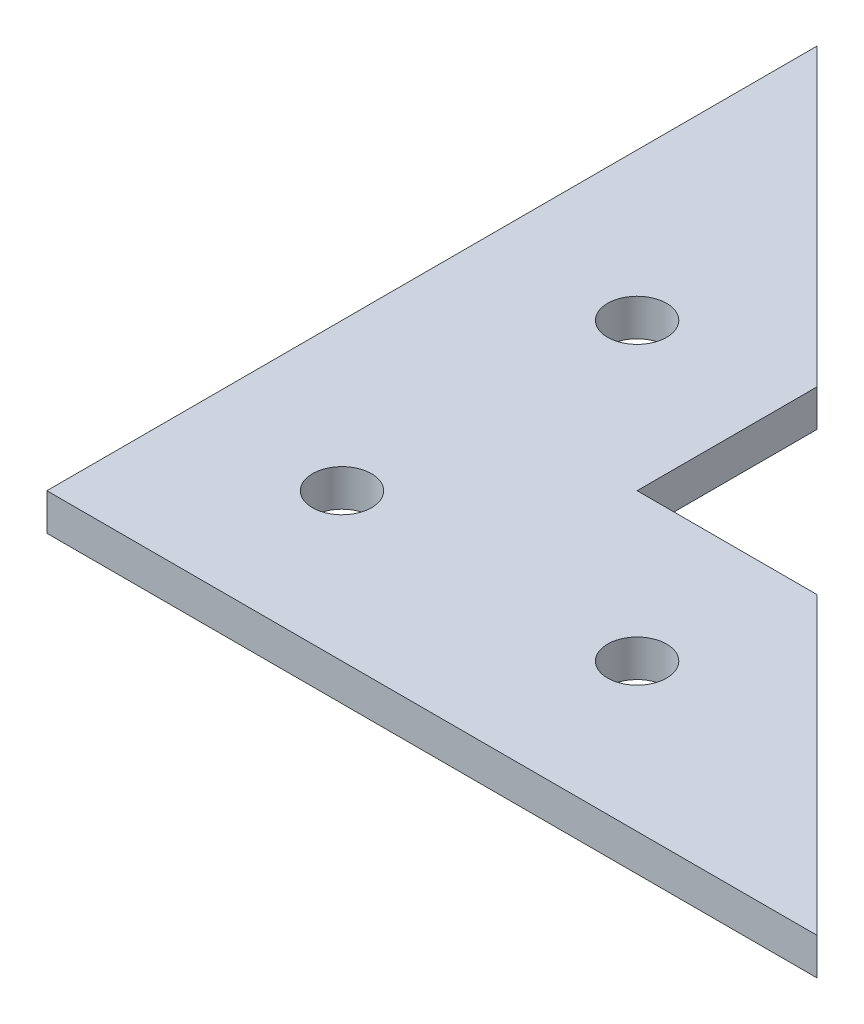
ISO-10303-21;
HEADER;
FILE_DESCRIPTION(('STEP AP214'),'2;1');
FILE_NAME('part.step','',(''),(''),'','','');
FILE_SCHEMA(('AUTOMOTIVE_DESIGN { 1 0 10303 214 1 1 1 1 }'));
ENDSEC;
DATA;
#1=APPLICATION_CONTEXT('core data for automotive mechanical design processes');
#2=APPLICATION_PROTOCOL_DEFINITION('international standard','automotive_design',2000,#1);
#3=PRODUCT_CONTEXT('',#1,'mechanical');
#4=PRODUCT('Part','Part','',(#3));
#5=PRODUCT_RELATED_PRODUCT_CATEGORY('part','',(#4));
#6=PRODUCT_DEFINITION_FORMATION('','',#4);
#7=PRODUCT_DEFINITION_CONTEXT('part definition',#1,'design');
#8=PRODUCT_DEFINITION('design','',#6,#7);
#9=PRODUCT_DEFINITION_SHAPE('','',#8);
#10=(LENGTH_UNIT() NAMED_UNIT(*) SI_UNIT(.MILLI.,.METRE.));
#11=(NAMED_UNIT(*) PLANE_ANGLE_UNIT() SI_UNIT($,.RADIAN.));
#12=(NAMED_UNIT(*) SI_UNIT($,.STERADIAN.) SOLID_ANGLE_UNIT());
#13=UNCERTAINTY_MEASURE_WITH_UNIT(LENGTH_MEASURE(1.E-05),#10,'distance_accuracy_value','');
#14=(GEOMETRIC_REPRESENTATION_CONTEXT(3) GLOBAL_UNCERTAINTY_ASSIGNED_CONTEXT((#13)) GLOBAL_UNIT_ASSIGNED_CONTEXT((#10,
#11,#12)) REPRESENTATION_CONTEXT('',''));
#15=CARTESIAN_POINT('',(0.,0.,0.));
#16=DIRECTION('',(0.,0.,1.));
#17=DIRECTION('',(1.,0.,0.));
#18=AXIS2_PLACEMENT_3D('',#15,#16,#17);
#19=CARTESIAN_POINT('',(0.,3.175,0.));
#20=DIRECTION('',(0.,-1.,0.));
#21=DIRECTION('',(0.,0.,-1.));
#22=AXIS2_PLACEMENT_3D('',#19,#20,#21);
#23=PLANE('',#22);
#24=DIRECTION('',(0.,0.,1.));
#25=VECTOR('',#24,1.);
#26=CARTESIAN_POINT('',(52.6993761970324,3.175,79.9375994006349));
#27=LINE('',#26,#25);
#28=CARTESIAN_POINT('',(52.6993761970324,3.175,13.6435994006349));
#29=VERTEX_POINT('',#28);
#30=CARTESIAN_POINT('',(52.6993761970324,3.175,79.9375994006349));
#31=VERTEX_POINT('',#30);
#32=EDGE_CURVE('E140',#29,#31,#27,.T.);
#33=ORIENTED_EDGE('',*,*,#32,.T.);
#34=DIRECTION('',(1.,0.,0.));
#35=VECTOR('',#34,1.);
#36=CARTESIAN_POINT('',(118.993376197032,3.175,79.9375994006349));
#37=LINE('',#36,#35);
#38=CARTESIAN_POINT('',(118.993376197032,3.175,79.9375994006349));
#39=VERTEX_POINT('',#38);
#40=EDGE_CURVE('E97',#31,#39,#37,.T.);
#41=ORIENTED_EDGE('',*,*,#40,.T.);
#42=DIRECTION('',(-0.70710678118655,0.,-0.707106781186545));
#43=VECTOR('',#42,1.);
#44=CARTESIAN_POINT('',(93.5933761970322,3.175,54.5375994006349));
#45=LINE('',#44,#43);
#46=CARTESIAN_POINT('',(93.5933761970322,3.175,54.5375994006349));
#47=VERTEX_POINT('',#46);
#48=EDGE_CURVE('E110',#39,#47,#45,.T.);
#49=ORIENTED_EDGE('',*,*,#48,.T.);
#50=DIRECTION('',(-1.,0.,0.));
#51=VECTOR('',#50,1.);
#52=CARTESIAN_POINT('',(78.0993761970324,3.175,54.5375994006349));
#53=LINE('',#52,#51);
#54=CARTESIAN_POINT('',(78.0993761970324,3.175,54.5375994006349));
#55=VERTEX_POINT('',#54);
#56=EDGE_CURVE('E104',#47,#55,#53,.T.);
#57=ORIENTED_EDGE('',*,*,#56,.T.);
#58=DIRECTION('',(0.,0.,-1.));
#59=VECTOR('',#58,1.);
#60=CARTESIAN_POINT('',(78.0993761970324,3.175,39.0435994006347));
#61=LINE('',#60,#59);
#62=CARTESIAN_POINT('',(78.0993761970324,3.175,39.0435994006347));
#63=VERTEX_POINT('',#62);
#64=EDGE_CURVE('E108',#55,#63,#61,.T.);
#65=ORIENTED_EDGE('',*,*,#64,.T.);
#66=DIRECTION('',(-0.70710678118655,0.,-0.707106781186545));
#67=VECTOR('',#66,1.);
#68=CARTESIAN_POINT('',(52.6993761970324,3.175,13.6435994006349));
#69=LINE('',#68,#67);
#70=EDGE_CURVE('E60',#63,#29,#69,.T.);
#71=ORIENTED_EDGE('',*,*,#70,.T.);
#72=EDGE_LOOP('',(#33,#41,#49,#57,#65,#71));
#73=FACE_BOUND('',#72,.T.);
#74=CARTESIAN_POINT('',(65.3993761970324,3.175,67.2375994006349));
#75=DIRECTION('',(0.,1.,0.));
#76=DIRECTION('',(0.,0.,1.));
#77=AXIS2_PLACEMENT_3D('',#74,#75,#76);
#78=CIRCLE('',#77,2.53999999999999);
#79=CARTESIAN_POINT('',(65.3993761970324,3.175,69.7775994006349));
#80=VERTEX_POINT('',#79);
#81=EDGE_CURVE('E134',#80,#80,#78,.T.);
#82=ORIENTED_EDGE('',*,*,#81,.F.);
#83=EDGE_LOOP('',(#82));
#84=FACE_BOUND('',#83,.T.);
#85=CARTESIAN_POINT('',(90.7993761970324,3.175,67.2375994006349));
#86=DIRECTION('',(0.,1.,0.));
#87=DIRECTION('',(0.,0.,1.));
#88=AXIS2_PLACEMENT_3D('',#85,#86,#87);
#89=CIRCLE('',#88,2.53999999999999);
#90=CARTESIAN_POINT('',(90.7993761970324,3.175,69.7775994006349));
#91=VERTEX_POINT('',#90);
#92=EDGE_CURVE('E148',#91,#91,#89,.T.);
#93=ORIENTED_EDGE('',*,*,#92,.F.);
#94=EDGE_LOOP('',(#93));
#95=FACE_BOUND('',#94,.T.);
#96=CARTESIAN_POINT('',(65.3993761970324,3.175,41.8375994006349));
#97=DIRECTION('',(0.,1.,0.));
#98=DIRECTION('',(0.,0.,1.));
#99=AXIS2_PLACEMENT_3D('',#96,#97,#98);
#100=CIRCLE('',#99,2.54);
#101=CARTESIAN_POINT('',(65.3993761970324,3.175,44.3775994006349));
#102=VERTEX_POINT('',#101);
#103=EDGE_CURVE('E155',#102,#102,#100,.T.);
#104=ORIENTED_EDGE('',*,*,#103,.F.);
#105=EDGE_LOOP('',(#104));
#106=FACE_BOUND('',#105,.T.);
#107=ADVANCED_FACE('F43',(#73,#84,#95,#106),#23,.F.);
#108=CARTESIAN_POINT('',(0.,0.,0.));
#109=DIRECTION('',(0.,-1.,0.));
#110=DIRECTION('',(0.,0.,-1.));
#111=AXIS2_PLACEMENT_3D('',#108,#109,#110);
#112=PLANE('',#111);
#113=CARTESIAN_POINT('',(90.7993761970324,0.,67.2375994006349));
#114=DIRECTION('',(0.,1.,0.));
#115=DIRECTION('',(0.,0.,1.));
#116=AXIS2_PLACEMENT_3D('',#113,#114,#115);
#117=CIRCLE('',#116,2.53999999999999);
#118=CARTESIAN_POINT('',(90.7993761970324,0.,69.7775994006349));
#119=VERTEX_POINT('',#118);
#120=EDGE_CURVE('E151',#119,#119,#117,.T.);
#121=ORIENTED_EDGE('',*,*,#120,.T.);
#122=EDGE_LOOP('',(#121));
#123=FACE_BOUND('',#122,.T.);
#124=DIRECTION('',(0.,0.,1.));
#125=VECTOR('',#124,1.);
#126=CARTESIAN_POINT('',(52.6993761970324,0.,79.9375994006349));
#127=LINE('',#126,#125);
#128=CARTESIAN_POINT('',(52.6993761970324,0.,13.6435994006349));
#129=VERTEX_POINT('',#128);
#130=CARTESIAN_POINT('',(52.6993761970324,0.,79.9375994006349));
#131=VERTEX_POINT('',#130);
#132=EDGE_CURVE('E128',#129,#131,#127,.T.);
#133=ORIENTED_EDGE('',*,*,#132,.F.);
#134=DIRECTION('',(-0.70710678118655,0.,-0.707106781186545));
#135=VECTOR('',#134,1.);
#136=CARTESIAN_POINT('',(52.6993761970324,0.,13.6435994006349));
#137=LINE('',#136,#135);
#138=CARTESIAN_POINT('',(78.0993761970324,0.,39.0435994006347));
#139=VERTEX_POINT('',#138);
#140=EDGE_CURVE('E89',#139,#129,#137,.T.);
#141=ORIENTED_EDGE('',*,*,#140,.F.);
#142=DIRECTION('',(0.,0.,-1.));
#143=VECTOR('',#142,1.);
#144=CARTESIAN_POINT('',(78.0993761970324,0.,39.0435994006347));
#145=LINE('',#144,#143);
#146=CARTESIAN_POINT('',(78.0993761970324,0.,54.5375994006349));
#147=VERTEX_POINT('',#146);
#148=EDGE_CURVE('E83',#147,#139,#145,.T.);
#149=ORIENTED_EDGE('',*,*,#148,.F.);
#150=DIRECTION('',(-1.,0.,0.));
#151=VECTOR('',#150,1.);
#152=CARTESIAN_POINT('',(78.0993761970324,0.,54.5375994006349));
#153=LINE('',#152,#151);
#154=CARTESIAN_POINT('',(93.5933761970322,0.,54.5375994006349));
#155=VERTEX_POINT('',#154);
#156=EDGE_CURVE('E118',#155,#147,#153,.T.);
#157=ORIENTED_EDGE('',*,*,#156,.F.);
#158=DIRECTION('',(-0.70710678118655,0.,-0.707106781186545));
#159=VECTOR('',#158,1.);
#160=CARTESIAN_POINT('',(93.5933761970322,0.,54.5375994006349));
#161=LINE('',#160,#159);
#162=CARTESIAN_POINT('',(118.993376197032,0.,79.9375994006349));
#163=VERTEX_POINT('',#162);
#164=EDGE_CURVE('E201',#163,#155,#161,.T.);
#165=ORIENTED_EDGE('',*,*,#164,.F.);
#166=DIRECTION('',(1.,0.,0.));
#167=VECTOR('',#166,1.);
#168=CARTESIAN_POINT('',(118.993376197032,0.,79.9375994006349));
#169=LINE('',#168,#167);
#170=EDGE_CURVE('E133',#131,#163,#169,.T.);
#171=ORIENTED_EDGE('',*,*,#170,.F.);
#172=EDGE_LOOP('',(#133,#141,#149,#157,#165,#171));
#173=FACE_BOUND('',#172,.T.);
#174=CARTESIAN_POINT('',(65.3993761970324,0.,67.2375994006349));
#175=DIRECTION('',(0.,1.,0.));
#176=DIRECTION('',(0.,0.,1.));
#177=AXIS2_PLACEMENT_3D('',#174,#175,#176);
#178=CIRCLE('',#177,2.53999999999999);
#179=CARTESIAN_POINT('',(65.3993761970324,0.,69.7775994006349));
#180=VERTEX_POINT('',#179);
#181=EDGE_CURVE('E144',#180,#180,#178,.T.);
#182=ORIENTED_EDGE('',*,*,#181,.T.);
#183=EDGE_LOOP('',(#182));
#184=FACE_BOUND('',#183,.T.);
#185=CARTESIAN_POINT('',(65.3993761970324,0.,41.8375994006349));
#186=DIRECTION('',(0.,1.,0.));
#187=DIRECTION('',(0.,0.,1.));
#188=AXIS2_PLACEMENT_3D('',#185,#186,#187);
#189=CIRCLE('',#188,2.54);
#190=CARTESIAN_POINT('',(65.3993761970324,0.,44.3775994006349));
#191=VERTEX_POINT('',#190);
#192=EDGE_CURVE('E158',#191,#191,#189,.T.);
#193=ORIENTED_EDGE('',*,*,#192,.T.);
#194=EDGE_LOOP('',(#193));
#195=FACE_BOUND('',#194,.T.);
#196=ADVANCED_FACE('F169',(#123,#173,#184,#195),#112,.T.);
#197=CARTESIAN_POINT('',(52.6993761970324,3.175,79.9375994006349));
#198=DIRECTION('',(1.,0.,0.));
#199=DIRECTION('',(0.,0.,-1.));
#200=AXIS2_PLACEMENT_3D('',#197,#198,#199);
#201=PLANE('',#200);
#202=ORIENTED_EDGE('',*,*,#132,.T.);
#203=DIRECTION('',(0.,-1.,0.));
#204=VECTOR('',#203,1.);
#205=CARTESIAN_POINT('',(52.6993761970324,3.175,79.9375994006349));
#206=LINE('',#205,#204);
#207=EDGE_CURVE('E12',#31,#131,#206,.T.);
#208=ORIENTED_EDGE('',*,*,#207,.F.);
#209=ORIENTED_EDGE('',*,*,#32,.F.);
#210=DIRECTION('',(0.,-1.,0.));
#211=VECTOR('',#210,1.);
#212=CARTESIAN_POINT('',(52.6993761970324,3.175,13.6435994006349));
#213=LINE('',#212,#211);
#214=EDGE_CURVE('E124',#29,#129,#213,.T.);
#215=ORIENTED_EDGE('',*,*,#214,.T.);
#216=EDGE_LOOP('',(#202,#208,#209,#215));
#217=FACE_BOUND('',#216,.T.);
#218=ADVANCED_FACE('F45',(#217),#201,.F.);
#219=CARTESIAN_POINT('',(118.993376197032,3.175,79.9375994006349));
#220=DIRECTION('',(0.,0.,-1.));
#221=DIRECTION('',(-1.,0.,0.));
#222=AXIS2_PLACEMENT_3D('',#219,#220,#221);
#223=PLANE('',#222);
#224=ORIENTED_EDGE('',*,*,#170,.T.);
#225=DIRECTION('',(0.,-1.,0.));
#226=VECTOR('',#225,1.);
#227=CARTESIAN_POINT('',(118.993376197032,3.175,79.9375994006349));
#228=LINE('',#227,#226);
#229=EDGE_CURVE('E52',#39,#163,#228,.T.);
#230=ORIENTED_EDGE('',*,*,#229,.F.);
#231=ORIENTED_EDGE('',*,*,#40,.F.);
#232=ORIENTED_EDGE('',*,*,#207,.T.);
#233=EDGE_LOOP('',(#224,#230,#231,#232));
#234=FACE_BOUND('',#233,.T.);
#235=ADVANCED_FACE('F189',(#234),#223,.F.);
#236=CARTESIAN_POINT('',(93.5933761970322,3.175,54.5375994006349));
#237=DIRECTION('',(-0.707106781186545,0.,0.70710678118655));
#238=DIRECTION('',(0.70710678118655,0.,0.707106781186545));
#239=AXIS2_PLACEMENT_3D('',#236,#237,#238);
#240=PLANE('',#239);
#241=ORIENTED_EDGE('',*,*,#164,.T.);
#242=DIRECTION('',(0.,-1.,0.));
#243=VECTOR('',#242,1.);
#244=CARTESIAN_POINT('',(93.5933761970322,3.175,54.5375994006349));
#245=LINE('',#244,#243);
#246=EDGE_CURVE('E119',#47,#155,#245,.T.);
#247=ORIENTED_EDGE('',*,*,#246,.F.);
#248=ORIENTED_EDGE('',*,*,#48,.F.);
#249=ORIENTED_EDGE('',*,*,#229,.T.);
#250=EDGE_LOOP('',(#241,#247,#248,#249));
#251=FACE_BOUND('',#250,.T.);
#252=ADVANCED_FACE('F187',(#251),#240,.F.);
#253=CARTESIAN_POINT('',(78.0993761970324,3.175,54.5375994006349));
#254=DIRECTION('',(0.,0.,1.));
#255=DIRECTION('',(1.,0.,0.));
#256=AXIS2_PLACEMENT_3D('',#253,#254,#255);
#257=PLANE('',#256);
#258=ORIENTED_EDGE('',*,*,#156,.T.);
#259=DIRECTION('',(0.,-1.,0.));
#260=VECTOR('',#259,1.);
#261=CARTESIAN_POINT('',(78.0993761970324,3.175,54.5375994006349));
#262=LINE('',#261,#260);
#263=EDGE_CURVE('E115',#55,#147,#262,.T.);
#264=ORIENTED_EDGE('',*,*,#263,.F.);
#265=ORIENTED_EDGE('',*,*,#56,.F.);
#266=ORIENTED_EDGE('',*,*,#246,.T.);
#267=EDGE_LOOP('',(#258,#264,#265,#266));
#268=FACE_BOUND('',#267,.T.);
#269=ADVANCED_FACE('F116',(#268),#257,.F.);
#270=CARTESIAN_POINT('',(78.0993761970324,3.175,39.0435994006347));
#271=DIRECTION('',(-1.,0.,0.));
#272=DIRECTION('',(0.,0.,1.));
#273=AXIS2_PLACEMENT_3D('',#270,#271,#272);
#274=PLANE('',#273);
#275=ORIENTED_EDGE('',*,*,#148,.T.);
#276=DIRECTION('',(0.,-1.,0.));
#277=VECTOR('',#276,1.);
#278=CARTESIAN_POINT('',(78.0993761970324,3.175,39.0435994006347));
#279=LINE('',#278,#277);
#280=EDGE_CURVE('E120',#63,#139,#279,.T.);
#281=ORIENTED_EDGE('',*,*,#280,.F.);
#282=ORIENTED_EDGE('',*,*,#64,.F.);
#283=ORIENTED_EDGE('',*,*,#263,.T.);
#284=EDGE_LOOP('',(#275,#281,#282,#283));
#285=FACE_BOUND('',#284,.T.);
#286=ADVANCED_FACE('F122',(#285),#274,.F.);
#287=CARTESIAN_POINT('',(52.6993761970324,3.175,13.6435994006349));
#288=DIRECTION('',(-0.707106781186545,0.,0.70710678118655));
#289=DIRECTION('',(0.70710678118655,0.,0.707106781186545));
#290=AXIS2_PLACEMENT_3D('',#287,#288,#289);
#291=PLANE('',#290);
#292=ORIENTED_EDGE('',*,*,#140,.T.);
#293=ORIENTED_EDGE('',*,*,#214,.F.);
#294=ORIENTED_EDGE('',*,*,#70,.F.);
#295=ORIENTED_EDGE('',*,*,#280,.T.);
#296=EDGE_LOOP('',(#292,#293,#294,#295));
#297=FACE_BOUND('',#296,.T.);
#298=ADVANCED_FACE('F180',(#297),#291,.F.);
#299=CARTESIAN_POINT('',(65.3993761970324,3.175,67.2375994006349));
#300=DIRECTION('',(0.,-1.,0.));
#301=DIRECTION('',(0.,0.,-1.));
#302=AXIS2_PLACEMENT_3D('',#299,#300,#301);
#303=CYLINDRICAL_SURFACE('',#302,2.53999999999999);
#304=ORIENTED_EDGE('',*,*,#81,.T.);
#305=EDGE_LOOP('',(#304));
#306=FACE_BOUND('',#305,.T.);
#307=ORIENTED_EDGE('',*,*,#181,.F.);
#308=EDGE_LOOP('',(#307));
#309=FACE_BOUND('',#308,.T.);
#310=ADVANCED_FACE('F177',(#306,#309),#303,.F.);
#311=CARTESIAN_POINT('',(90.7993761970324,3.175,67.2375994006349));
#312=DIRECTION('',(0.,-1.,0.));
#313=DIRECTION('',(0.,0.,-1.));
#314=AXIS2_PLACEMENT_3D('',#311,#312,#313);
#315=CYLINDRICAL_SURFACE('',#314,2.53999999999999);
#316=ORIENTED_EDGE('',*,*,#92,.T.);
#317=EDGE_LOOP('',(#316));
#318=FACE_BOUND('',#317,.T.);
#319=ORIENTED_EDGE('',*,*,#120,.F.);
#320=EDGE_LOOP('',(#319));
#321=FACE_BOUND('',#320,.T.);
#322=ADVANCED_FACE('F214',(#318,#321),#315,.F.);
#323=CARTESIAN_POINT('',(65.3993761970324,3.175,41.8375994006349));
#324=DIRECTION('',(0.,-1.,0.));
#325=DIRECTION('',(0.,0.,-1.));
#326=AXIS2_PLACEMENT_3D('',#323,#324,#325);
#327=CYLINDRICAL_SURFACE('',#326,2.54);
#328=ORIENTED_EDGE('',*,*,#103,.T.);
#329=EDGE_LOOP('',(#328));
#330=FACE_BOUND('',#329,.T.);
#331=ORIENTED_EDGE('',*,*,#192,.F.);
#332=EDGE_LOOP('',(#331));
#333=FACE_BOUND('',#332,.T.);
#334=ADVANCED_FACE('F165',(#330,#333),#327,.F.);
#335=CLOSED_SHELL('',(#107,#196,#218,#235,#252,#269,#286,#298,#310,#322,#334));
#336=MANIFOLD_SOLID_BREP('B2',#335);
#337=ADVANCED_BREP_SHAPE_REPRESENTATION('',(#18,#336),#14);
#338=SHAPE_DEFINITION_REPRESENTATION(#9,#337);
ENDSEC;
END-ISO-10303-21;
